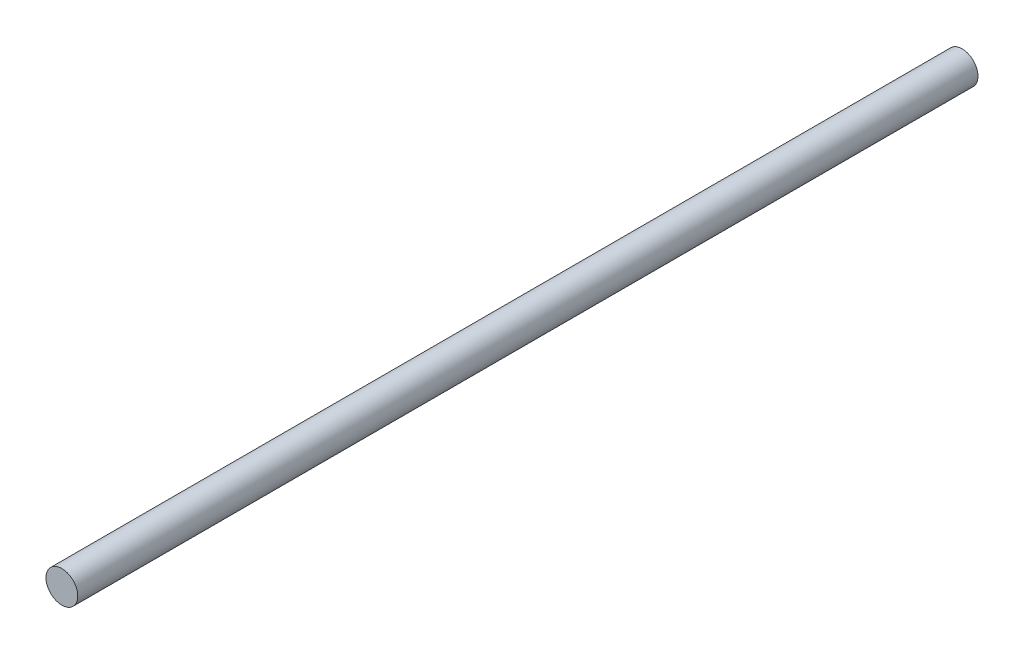
ISO-10303-21;
HEADER;
FILE_DESCRIPTION(('STEP AP214'),'2;1');
FILE_NAME('part.step','',(''),(''),'','','');
FILE_SCHEMA(('AUTOMOTIVE_DESIGN { 1 0 10303 214 1 1 1 1 }'));
ENDSEC;
DATA;
#1=APPLICATION_CONTEXT('core data for automotive mechanical design processes');
#2=APPLICATION_PROTOCOL_DEFINITION('international standard','automotive_design',2000,#1);
#3=PRODUCT_CONTEXT('',#1,'mechanical');
#4=PRODUCT('Part','Part','',(#3));
#5=PRODUCT_RELATED_PRODUCT_CATEGORY('part','',(#4));
#6=PRODUCT_DEFINITION_FORMATION('','',#4);
#7=PRODUCT_DEFINITION_CONTEXT('part definition',#1,'design');
#8=PRODUCT_DEFINITION('design','',#6,#7);
#9=PRODUCT_DEFINITION_SHAPE('','',#8);
#10=(LENGTH_UNIT() NAMED_UNIT(*) SI_UNIT(.MILLI.,.METRE.));
#11=(NAMED_UNIT(*) PLANE_ANGLE_UNIT() SI_UNIT($,.RADIAN.));
#12=(NAMED_UNIT(*) SI_UNIT($,.STERADIAN.) SOLID_ANGLE_UNIT());
#13=UNCERTAINTY_MEASURE_WITH_UNIT(LENGTH_MEASURE(1.E-05),#10,'distance_accuracy_value','');
#14=(GEOMETRIC_REPRESENTATION_CONTEXT(3) GLOBAL_UNCERTAINTY_ASSIGNED_CONTEXT((#13)) GLOBAL_UNIT_ASSIGNED_CONTEXT((#10,
#11,#12)) REPRESENTATION_CONTEXT('',''));
#15=CARTESIAN_POINT('',(0.,0.,0.));
#16=DIRECTION('',(0.,0.,1.));
#17=DIRECTION('',(1.,0.,0.));
#18=AXIS2_PLACEMENT_3D('',#15,#16,#17);
#19=CARTESIAN_POINT('',(0.,0.,170.));
#20=DIRECTION('',(0.,0.,-1.));
#21=DIRECTION('',(-1.,0.,0.));
#22=AXIS2_PLACEMENT_3D('',#19,#20,#21);
#23=CYLINDRICAL_SURFACE('',#22,3.);
#24=CARTESIAN_POINT('',(0.,0.,170.));
#25=DIRECTION('',(0.,0.,1.));
#26=DIRECTION('',(1.,0.,0.));
#27=AXIS2_PLACEMENT_3D('',#24,#25,#26);
#28=CIRCLE('',#27,3.);
#29=CARTESIAN_POINT('',(3.,0.,170.));
#30=VERTEX_POINT('',#29);
#31=EDGE_CURVE('E10',#30,#30,#28,.T.);
#32=ORIENTED_EDGE('',*,*,#31,.F.);
#33=EDGE_LOOP('',(#32));
#34=FACE_BOUND('',#33,.T.);
#35=CARTESIAN_POINT('',(0.,0.,0.));
#36=DIRECTION('',(0.,0.,1.));
#37=DIRECTION('',(1.,0.,0.));
#38=AXIS2_PLACEMENT_3D('',#35,#36,#37);
#39=CIRCLE('',#38,3.);
#40=CARTESIAN_POINT('',(3.,0.,0.));
#41=VERTEX_POINT('',#40);
#42=EDGE_CURVE('E40',#41,#41,#39,.T.);
#43=ORIENTED_EDGE('',*,*,#42,.T.);
#44=EDGE_LOOP('',(#43));
#45=FACE_BOUND('',#44,.T.);
#46=ADVANCED_FACE('F37',(#34,#45),#23,.T.);
#47=CARTESIAN_POINT('',(0.,0.,170.));
#48=DIRECTION('',(0.,0.,1.));
#49=DIRECTION('',(1.,0.,0.));
#50=AXIS2_PLACEMENT_3D('',#47,#48,#49);
#51=PLANE('',#50);
#52=ORIENTED_EDGE('',*,*,#31,.T.);
#53=EDGE_LOOP('',(#52));
#54=FACE_BOUND('',#53,.T.);
#55=ADVANCED_FACE('F52',(#54),#51,.T.);
#56=CARTESIAN_POINT('',(0.,0.,0.));
#57=DIRECTION('',(0.,0.,1.));
#58=DIRECTION('',(1.,0.,0.));
#59=AXIS2_PLACEMENT_3D('',#56,#57,#58);
#60=PLANE('',#59);
#61=ORIENTED_EDGE('',*,*,#42,.F.);
#62=EDGE_LOOP('',(#61));
#63=FACE_BOUND('',#62,.T.);
#64=ADVANCED_FACE('F50',(#63),#60,.F.);
#65=CLOSED_SHELL('',(#46,#55,#64));
#66=MANIFOLD_SOLID_BREP('B2',#65);
#67=ADVANCED_BREP_SHAPE_REPRESENTATION('',(#18,#66),#14);
#68=SHAPE_DEFINITION_REPRESENTATION(#9,#67);
ENDSEC;
END-ISO-10303-21;
